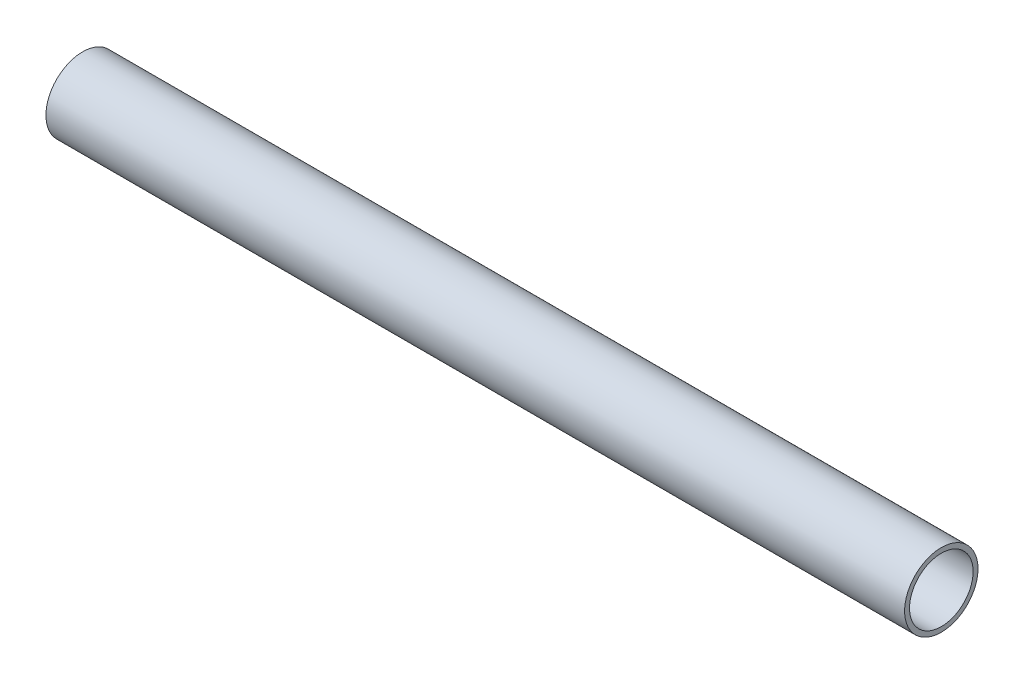
ISO-10303-21;
HEADER;
FILE_DESCRIPTION(('STEP AP214'),'2;1');
FILE_NAME('part.step','',(''),(''),'','','');
FILE_SCHEMA(('AUTOMOTIVE_DESIGN { 1 0 10303 214 1 1 1 1 }'));
ENDSEC;
DATA;
#1=APPLICATION_CONTEXT('core data for automotive mechanical design processes');
#2=APPLICATION_PROTOCOL_DEFINITION('international standard','automotive_design',2000,#1);
#3=PRODUCT_CONTEXT('',#1,'mechanical');
#4=PRODUCT('Part','Part','',(#3));
#5=PRODUCT_RELATED_PRODUCT_CATEGORY('part','',(#4));
#6=PRODUCT_DEFINITION_FORMATION('','',#4);
#7=PRODUCT_DEFINITION_CONTEXT('part definition',#1,'design');
#8=PRODUCT_DEFINITION('design','',#6,#7);
#9=PRODUCT_DEFINITION_SHAPE('','',#8);
#10=(LENGTH_UNIT() NAMED_UNIT(*) SI_UNIT(.MILLI.,.METRE.));
#11=(NAMED_UNIT(*) PLANE_ANGLE_UNIT() SI_UNIT($,.RADIAN.));
#12=(NAMED_UNIT(*) SI_UNIT($,.STERADIAN.) SOLID_ANGLE_UNIT());
#13=UNCERTAINTY_MEASURE_WITH_UNIT(LENGTH_MEASURE(1.E-05),#10,'distance_accuracy_value','');
#14=(GEOMETRIC_REPRESENTATION_CONTEXT(3) GLOBAL_UNCERTAINTY_ASSIGNED_CONTEXT((#13)) GLOBAL_UNIT_ASSIGNED_CONTEXT((#10,
#11,#12)) REPRESENTATION_CONTEXT('',''));
#15=CARTESIAN_POINT('',(0.,0.,0.));
#16=DIRECTION('',(0.,0.,1.));
#17=DIRECTION('',(1.,0.,0.));
#18=AXIS2_PLACEMENT_3D('',#15,#16,#17);
#19=CARTESIAN_POINT('',(175.5,0.,0.));
#20=DIRECTION('',(1.,0.,0.));
#21=DIRECTION('',(0.,0.,-1.));
#22=AXIS2_PLACEMENT_3D('',#19,#20,#21);
#23=PLANE('',#22);
#24=CARTESIAN_POINT('',(175.5,0.,0.));
#25=DIRECTION('',(1.,0.,0.));
#26=DIRECTION('',(0.,0.,-1.));
#27=AXIS2_PLACEMENT_3D('',#24,#25,#26);
#28=CIRCLE('',#27,7.5);
#29=CARTESIAN_POINT('',(175.5,0.,-7.5));
#30=VERTEX_POINT('',#29);
#31=EDGE_CURVE('E10',#30,#30,#28,.T.);
#32=ORIENTED_EDGE('',*,*,#31,.T.);
#33=EDGE_LOOP('',(#32));
#34=FACE_BOUND('',#33,.T.);
#35=CARTESIAN_POINT('',(175.5,0.,0.));
#36=DIRECTION('',(1.,0.,0.));
#37=DIRECTION('',(0.,0.,-1.));
#38=AXIS2_PLACEMENT_3D('',#35,#36,#37);
#39=CIRCLE('',#38,6.5);
#40=CARTESIAN_POINT('',(175.5,0.,-6.5));
#41=VERTEX_POINT('',#40);
#42=EDGE_CURVE('E46',#41,#41,#39,.T.);
#43=ORIENTED_EDGE('',*,*,#42,.F.);
#44=EDGE_LOOP('',(#43));
#45=FACE_BOUND('',#44,.T.);
#46=ADVANCED_FACE('F35',(#34,#45),#23,.T.);
#47=CARTESIAN_POINT('',(0.,0.,0.));
#48=DIRECTION('',(1.,0.,0.));
#49=DIRECTION('',(0.,0.,-1.));
#50=AXIS2_PLACEMENT_3D('',#47,#48,#49);
#51=PLANE('',#50);
#52=CARTESIAN_POINT('',(0.,0.,0.));
#53=DIRECTION('',(1.,0.,0.));
#54=DIRECTION('',(0.,0.,-1.));
#55=AXIS2_PLACEMENT_3D('',#52,#53,#54);
#56=CIRCLE('',#55,7.5);
#57=CARTESIAN_POINT('',(0.,0.,-7.5));
#58=VERTEX_POINT('',#57);
#59=EDGE_CURVE('E39',#58,#58,#56,.T.);
#60=ORIENTED_EDGE('',*,*,#59,.F.);
#61=EDGE_LOOP('',(#60));
#62=FACE_BOUND('',#61,.T.);
#63=CARTESIAN_POINT('',(0.,0.,0.));
#64=DIRECTION('',(1.,0.,0.));
#65=DIRECTION('',(0.,0.,-1.));
#66=AXIS2_PLACEMENT_3D('',#63,#64,#65);
#67=CIRCLE('',#66,6.5);
#68=CARTESIAN_POINT('',(0.,0.,-6.5));
#69=VERTEX_POINT('',#68);
#70=EDGE_CURVE('E48',#69,#69,#67,.T.);
#71=ORIENTED_EDGE('',*,*,#70,.T.);
#72=EDGE_LOOP('',(#71));
#73=FACE_BOUND('',#72,.T.);
#74=ADVANCED_FACE('F58',(#62,#73),#51,.F.);
#75=CARTESIAN_POINT('',(175.5,0.,0.));
#76=DIRECTION('',(-1.,0.,0.));
#77=DIRECTION('',(0.,0.,1.));
#78=AXIS2_PLACEMENT_3D('',#75,#76,#77);
#79=CYLINDRICAL_SURFACE('',#78,7.5);
#80=ORIENTED_EDGE('',*,*,#31,.F.);
#81=EDGE_LOOP('',(#80));
#82=FACE_BOUND('',#81,.T.);
#83=ORIENTED_EDGE('',*,*,#59,.T.);
#84=EDGE_LOOP('',(#83));
#85=FACE_BOUND('',#84,.T.);
#86=ADVANCED_FACE('F37',(#82,#85),#79,.T.);
#87=CARTESIAN_POINT('',(175.5,0.,0.));
#88=DIRECTION('',(-1.,0.,0.));
#89=DIRECTION('',(0.,0.,1.));
#90=AXIS2_PLACEMENT_3D('',#87,#88,#89);
#91=CYLINDRICAL_SURFACE('',#90,6.5);
#92=ORIENTED_EDGE('',*,*,#42,.T.);
#93=EDGE_LOOP('',(#92));
#94=FACE_BOUND('',#93,.T.);
#95=ORIENTED_EDGE('',*,*,#70,.F.);
#96=EDGE_LOOP('',(#95));
#97=FACE_BOUND('',#96,.T.);
#98=ADVANCED_FACE('F54',(#94,#97),#91,.F.);
#99=CLOSED_SHELL('',(#46,#74,#86,#98));
#100=MANIFOLD_SOLID_BREP('B2',#99);
#101=ADVANCED_BREP_SHAPE_REPRESENTATION('',(#18,#100),#14);
#102=SHAPE_DEFINITION_REPRESENTATION(#9,#101);
ENDSEC;
END-ISO-10303-21;
